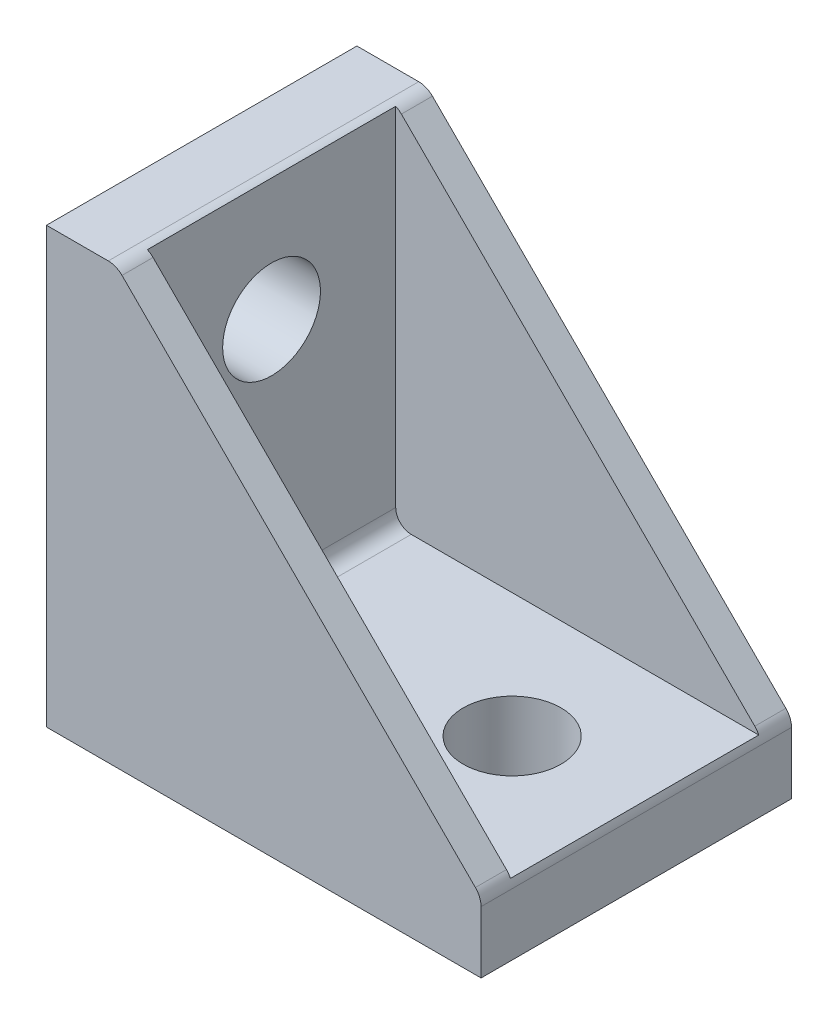
ISO-10303-21;
HEADER;
FILE_DESCRIPTION(('STEP AP214'),'2;1');
FILE_NAME('part.step','',(''),(''),'','','');
FILE_SCHEMA(('AUTOMOTIVE_DESIGN { 1 0 10303 214 1 1 1 1 }'));
ENDSEC;
DATA;
#1=APPLICATION_CONTEXT('core data for automotive mechanical design processes');
#2=APPLICATION_PROTOCOL_DEFINITION('international standard','automotive_design',2000,#1);
#3=PRODUCT_CONTEXT('',#1,'mechanical');
#4=PRODUCT('Part','Part','',(#3));
#5=PRODUCT_RELATED_PRODUCT_CATEGORY('part','',(#4));
#6=PRODUCT_DEFINITION_FORMATION('','',#4);
#7=PRODUCT_DEFINITION_CONTEXT('part definition',#1,'design');
#8=PRODUCT_DEFINITION('design','',#6,#7);
#9=PRODUCT_DEFINITION_SHAPE('','',#8);
#10=(LENGTH_UNIT() NAMED_UNIT(*) SI_UNIT(.MILLI.,.METRE.));
#11=(NAMED_UNIT(*) PLANE_ANGLE_UNIT() SI_UNIT($,.RADIAN.));
#12=(NAMED_UNIT(*) SI_UNIT($,.STERADIAN.) SOLID_ANGLE_UNIT());
#13=UNCERTAINTY_MEASURE_WITH_UNIT(LENGTH_MEASURE(1.E-05),#10,'distance_accuracy_value','');
#14=(GEOMETRIC_REPRESENTATION_CONTEXT(3) GLOBAL_UNCERTAINTY_ASSIGNED_CONTEXT((#13)) GLOBAL_UNIT_ASSIGNED_CONTEXT((#10,
#11,#12)) REPRESENTATION_CONTEXT('',''));
#15=CARTESIAN_POINT('',(0.,0.,0.));
#16=DIRECTION('',(0.,0.,1.));
#17=DIRECTION('',(1.,0.,0.));
#18=AXIS2_PLACEMENT_3D('',#15,#16,#17);
#19=CARTESIAN_POINT('',(4.5,28.,-10.));
#20=DIRECTION('',(0.707106781186545,0.70710678118655,0.));
#21=DIRECTION('',(-0.70710678118655,0.707106781186545,0.));
#22=AXIS2_PLACEMENT_3D('',#19,#20,#21);
#23=PLANE('',#22);
#24=DIRECTION('',(0.,0.,1.));
#25=VECTOR('',#24,1.);
#26=CARTESIAN_POINT('',(27.6338834764832,4.86611652351699,-10.));
#27=LINE('',#26,#25);
#28=CARTESIAN_POINT('',(27.6338834764832,4.86611652351699,8.));
#29=VERTEX_POINT('',#28);
#30=CARTESIAN_POINT('',(27.6338834764832,4.86611652351699,10.));
#31=VERTEX_POINT('',#30);
#32=EDGE_CURVE('E218',#29,#31,#27,.T.);
#33=ORIENTED_EDGE('',*,*,#32,.F.);
#34=DIRECTION('',(-0.70710678118655,0.707106781186545,0.));
#35=VECTOR('',#34,1.);
#36=CARTESIAN_POINT('',(4.5,28.,8.00000000000001));
#37=LINE('',#36,#35);
#38=CARTESIAN_POINT('',(4.86611652351682,27.6338834764832,8.00000000000001));
#39=VERTEX_POINT('',#38);
#40=EDGE_CURVE('E231',#29,#39,#37,.T.);
#41=ORIENTED_EDGE('',*,*,#40,.T.);
#42=DIRECTION('',(0.,0.,1.));
#43=VECTOR('',#42,1.);
#44=CARTESIAN_POINT('',(4.86611652351682,27.6338834764832,-10.));
#45=LINE('',#44,#43);
#46=CARTESIAN_POINT('',(4.86611652351682,27.6338834764832,10.));
#47=VERTEX_POINT('',#46);
#48=EDGE_CURVE('E432',#47,#39,#45,.F.);
#49=ORIENTED_EDGE('',*,*,#48,.F.);
#50=DIRECTION('',(0.70710678118655,-0.707106781186545,0.));
#51=VECTOR('',#50,1.);
#52=CARTESIAN_POINT('',(4.86611652351682,27.6338834764832,10.));
#53=LINE('',#52,#51);
#54=EDGE_CURVE('E337',#47,#31,#53,.T.);
#55=ORIENTED_EDGE('',*,*,#54,.T.);
#56=EDGE_LOOP('',(#33,#41,#49,#55));
#57=FACE_BOUND('',#56,.T.);
#58=ADVANCED_FACE('F15',(#57),#23,.T.);
#59=CARTESIAN_POINT('',(26.75,3.9822330470338,-10.));
#60=DIRECTION('',(0.,0.,1.));
#61=DIRECTION('',(1.,0.,0.));
#62=AXIS2_PLACEMENT_3D('',#59,#60,#61);
#63=CYLINDRICAL_SURFACE('',#62,1.25);
#64=DIRECTION('',(0.,0.,1.));
#65=VECTOR('',#64,1.);
#66=CARTESIAN_POINT('',(27.8877246514056,4.5,-10.));
#67=LINE('',#66,#65);
#68=CARTESIAN_POINT('',(27.8877246514056,4.5,-8.));
#69=VERTEX_POINT('',#68);
#70=CARTESIAN_POINT('',(27.8877246514056,4.5,8.));
#71=VERTEX_POINT('',#70);
#72=EDGE_CURVE('E206',#69,#71,#67,.T.);
#73=ORIENTED_EDGE('',*,*,#72,.T.);
#74=CARTESIAN_POINT('',(26.75,3.9822330470338,8.));
#75=DIRECTION('',(0.,0.,-1.));
#76=DIRECTION('',(-1.,0.,0.));
#77=AXIS2_PLACEMENT_3D('',#74,#75,#76);
#78=CIRCLE('',#77,1.25);
#79=EDGE_CURVE('E235',#71,#29,#78,.F.);
#80=ORIENTED_EDGE('',*,*,#79,.T.);
#81=ORIENTED_EDGE('',*,*,#32,.T.);
#82=CARTESIAN_POINT('',(26.75,3.9822330470338,10.));
#83=DIRECTION('',(0.,0.,1.));
#84=DIRECTION('',(1.,0.,0.));
#85=AXIS2_PLACEMENT_3D('',#82,#83,#84);
#86=CIRCLE('',#85,1.25);
#87=CARTESIAN_POINT('',(28.,3.9822330470338,10.));
#88=VERTEX_POINT('',#87);
#89=EDGE_CURVE('E340',#31,#88,#86,.F.);
#90=ORIENTED_EDGE('',*,*,#89,.T.);
#91=DIRECTION('',(0.,0.,-1.));
#92=VECTOR('',#91,1.);
#93=CARTESIAN_POINT('',(28.,3.9822330470338,-10.));
#94=LINE('',#93,#92);
#95=CARTESIAN_POINT('',(28.,3.9822330470338,-10.));
#96=VERTEX_POINT('',#95);
#97=EDGE_CURVE('E325',#96,#88,#94,.F.);
#98=ORIENTED_EDGE('',*,*,#97,.F.);
#99=CARTESIAN_POINT('',(26.75,3.9822330470338,-10.));
#100=DIRECTION('',(0.,0.,1.));
#101=DIRECTION('',(1.,0.,0.));
#102=AXIS2_PLACEMENT_3D('',#99,#100,#101);
#103=CIRCLE('',#102,1.25);
#104=CARTESIAN_POINT('',(27.6338834764832,4.86611652351699,-10.));
#105=VERTEX_POINT('',#104);
#106=EDGE_CURVE('E219',#96,#105,#103,.T.);
#107=ORIENTED_EDGE('',*,*,#106,.T.);
#108=DIRECTION('',(0.,0.,1.));
#109=VECTOR('',#108,1.);
#110=CARTESIAN_POINT('',(27.6338834764832,4.86611652351699,-10.));
#111=LINE('',#110,#109);
#112=CARTESIAN_POINT('',(27.6338834764832,4.86611652351699,-8.));
#113=VERTEX_POINT('',#112);
#114=EDGE_CURVE('E230',#113,#105,#111,.F.);
#115=ORIENTED_EDGE('',*,*,#114,.F.);
#116=CARTESIAN_POINT('',(26.75,3.9822330470338,-8.));
#117=DIRECTION('',(0.,0.,1.));
#118=DIRECTION('',(1.,0.,0.));
#119=AXIS2_PLACEMENT_3D('',#116,#117,#118);
#120=CIRCLE('',#119,1.25);
#121=EDGE_CURVE('E223',#113,#69,#120,.F.);
#122=ORIENTED_EDGE('',*,*,#121,.T.);
#123=EDGE_LOOP('',(#73,#80,#81,#90,#98,#107,#115,#122));
#124=FACE_BOUND('',#123,.T.);
#125=ADVANCED_FACE('F228',(#124),#63,.T.);
#126=CARTESIAN_POINT('',(3.98223304703363,26.75,-10.));
#127=DIRECTION('',(0.,0.,1.));
#128=DIRECTION('',(1.,0.,0.));
#129=AXIS2_PLACEMENT_3D('',#126,#127,#128);
#130=CYLINDRICAL_SURFACE('',#129,1.25);
#131=DIRECTION('',(0.,0.,1.));
#132=VECTOR('',#131,1.);
#133=CARTESIAN_POINT('',(4.5,27.8877246514056,-10.));
#134=LINE('',#133,#132);
#135=CARTESIAN_POINT('',(4.5,27.8877246514056,8.00000000000001));
#136=VERTEX_POINT('',#135);
#137=CARTESIAN_POINT('',(4.5,27.8877246514056,-8.));
#138=VERTEX_POINT('',#137);
#139=EDGE_CURVE('E332',#136,#138,#134,.F.);
#140=ORIENTED_EDGE('',*,*,#139,.T.);
#141=CARTESIAN_POINT('',(3.98223304703363,26.75,-8.));
#142=DIRECTION('',(0.,0.,1.));
#143=DIRECTION('',(1.,0.,0.));
#144=AXIS2_PLACEMENT_3D('',#141,#142,#143);
#145=CIRCLE('',#144,1.25);
#146=CARTESIAN_POINT('',(4.86611652351682,27.6338834764832,-8.));
#147=VERTEX_POINT('',#146);
#148=EDGE_CURVE('E232',#138,#147,#145,.F.);
#149=ORIENTED_EDGE('',*,*,#148,.T.);
#150=DIRECTION('',(0.,0.,1.));
#151=VECTOR('',#150,1.);
#152=CARTESIAN_POINT('',(4.86611652351682,27.6338834764832,-10.));
#153=LINE('',#152,#151);
#154=CARTESIAN_POINT('',(4.86611652351682,27.6338834764832,-10.));
#155=VERTEX_POINT('',#154);
#156=EDGE_CURVE('E328',#155,#147,#153,.T.);
#157=ORIENTED_EDGE('',*,*,#156,.F.);
#158=CARTESIAN_POINT('',(3.98223304703363,26.75,-10.));
#159=DIRECTION('',(0.,0.,1.));
#160=DIRECTION('',(1.,0.,0.));
#161=AXIS2_PLACEMENT_3D('',#158,#159,#160);
#162=CIRCLE('',#161,1.25);
#163=CARTESIAN_POINT('',(3.98223304703363,28.,-10.));
#164=VERTEX_POINT('',#163);
#165=EDGE_CURVE('E443',#155,#164,#162,.T.);
#166=ORIENTED_EDGE('',*,*,#165,.T.);
#167=DIRECTION('',(0.,0.,1.));
#168=VECTOR('',#167,1.);
#169=CARTESIAN_POINT('',(3.98223304703363,28.,-10.));
#170=LINE('',#169,#168);
#171=CARTESIAN_POINT('',(3.98223304703363,28.,10.));
#172=VERTEX_POINT('',#171);
#173=EDGE_CURVE('E256',#172,#164,#170,.F.);
#174=ORIENTED_EDGE('',*,*,#173,.F.);
#175=CARTESIAN_POINT('',(3.98223304703363,26.75,10.));
#176=DIRECTION('',(0.,0.,1.));
#177=DIRECTION('',(1.,0.,0.));
#178=AXIS2_PLACEMENT_3D('',#175,#176,#177);
#179=CIRCLE('',#178,1.25);
#180=EDGE_CURVE('E435',#172,#47,#179,.F.);
#181=ORIENTED_EDGE('',*,*,#180,.T.);
#182=ORIENTED_EDGE('',*,*,#48,.T.);
#183=CARTESIAN_POINT('',(3.98223304703363,26.75,8.00000000000001));
#184=DIRECTION('',(0.,0.,-1.));
#185=DIRECTION('',(-1.,0.,0.));
#186=AXIS2_PLACEMENT_3D('',#183,#184,#185);
#187=CIRCLE('',#186,1.25);
#188=EDGE_CURVE('E452',#39,#136,#187,.F.);
#189=ORIENTED_EDGE('',*,*,#188,.T.);
#190=EDGE_LOOP('',(#140,#149,#157,#166,#174,#181,#182,#189));
#191=FACE_BOUND('',#190,.T.);
#192=ADVANCED_FACE('F475',(#191),#130,.T.);
#193=CARTESIAN_POINT('',(4.5,28.,-10.));
#194=DIRECTION('',(0.707106781186545,0.70710678118655,0.));
#195=DIRECTION('',(-0.70710678118655,0.707106781186545,0.));
#196=AXIS2_PLACEMENT_3D('',#193,#194,#195);
#197=PLANE('',#196);
#198=ORIENTED_EDGE('',*,*,#156,.T.);
#199=DIRECTION('',(0.70710678118655,-0.707106781186545,0.));
#200=VECTOR('',#199,1.);
#201=CARTESIAN_POINT('',(4.5,28.,-8.));
#202=LINE('',#201,#200);
#203=EDGE_CURVE('E246',#147,#113,#202,.T.);
#204=ORIENTED_EDGE('',*,*,#203,.T.);
#205=ORIENTED_EDGE('',*,*,#114,.T.);
#206=DIRECTION('',(0.70710678118655,-0.707106781186545,0.));
#207=VECTOR('',#206,1.);
#208=CARTESIAN_POINT('',(4.86611652351682,27.6338834764832,-10.));
#209=LINE('',#208,#207);
#210=EDGE_CURVE('E252',#155,#105,#209,.T.);
#211=ORIENTED_EDGE('',*,*,#210,.F.);
#212=EDGE_LOOP('',(#198,#204,#205,#211));
#213=FACE_BOUND('',#212,.T.);
#214=ADVANCED_FACE('F496',(#213),#197,.T.);
#215=CARTESIAN_POINT('',(23.5,-0.7,-4.));
#216=DIRECTION('',(0.,-1.,0.));
#217=DIRECTION('',(1.,0.,0.));
#218=AXIS2_PLACEMENT_3D('',#215,#216,#217);
#219=PLANE('',#218);
#220=DIRECTION('',(0.,0.,1.));
#221=VECTOR('',#220,1.);
#222=CARTESIAN_POINT('',(23.5,-0.7,-4.));
#223=LINE('',#222,#221);
#224=CARTESIAN_POINT('',(23.5,-0.7,-4.));
#225=VERTEX_POINT('',#224);
#226=CARTESIAN_POINT('',(23.5,-0.7,4.));
#227=VERTEX_POINT('',#226);
#228=EDGE_CURVE('E425',#225,#227,#223,.T.);
#229=ORIENTED_EDGE('',*,*,#228,.F.);
#230=DIRECTION('',(-1.,0.,0.));
#231=VECTOR('',#230,1.);
#232=CARTESIAN_POINT('',(19.5,-0.7,-4.));
#233=LINE('',#232,#231);
#234=CARTESIAN_POINT('',(25.5,-0.7,-4.));
#235=VERTEX_POINT('',#234);
#236=EDGE_CURVE('E428',#235,#225,#233,.T.);
#237=ORIENTED_EDGE('',*,*,#236,.F.);
#238=DIRECTION('',(0.,0.,1.));
#239=VECTOR('',#238,1.);
#240=CARTESIAN_POINT('',(25.5,-0.7,-4.));
#241=LINE('',#240,#239);
#242=CARTESIAN_POINT('',(25.5,-0.7,4.));
#243=VERTEX_POINT('',#242);
#244=EDGE_CURVE('E412',#243,#235,#241,.F.);
#245=ORIENTED_EDGE('',*,*,#244,.F.);
#246=DIRECTION('',(-1.,0.,0.));
#247=VECTOR('',#246,1.);
#248=CARTESIAN_POINT('',(19.5,-0.7,4.));
#249=LINE('',#248,#247);
#250=EDGE_CURVE('E420',#243,#227,#249,.T.);
#251=ORIENTED_EDGE('',*,*,#250,.T.);
#252=EDGE_LOOP('',(#229,#237,#245,#251));
#253=FACE_BOUND('',#252,.T.);
#254=ADVANCED_FACE('F493',(#253),#219,.T.);
#255=CARTESIAN_POINT('',(4.,-0.7,-4.));
#256=DIRECTION('',(0.,-1.,0.));
#257=DIRECTION('',(1.,0.,0.));
#258=AXIS2_PLACEMENT_3D('',#255,#256,#257);
#259=PLANE('',#258);
#260=DIRECTION('',(0.,0.,1.));
#261=VECTOR('',#260,1.);
#262=CARTESIAN_POINT('',(4.,-0.7,-4.));
#263=LINE('',#262,#261);
#264=CARTESIAN_POINT('',(4.,-0.7,-4.));
#265=VERTEX_POINT('',#264);
#266=CARTESIAN_POINT('',(4.,-0.7,4.));
#267=VERTEX_POINT('',#266);
#268=EDGE_CURVE('E403',#265,#267,#263,.T.);
#269=ORIENTED_EDGE('',*,*,#268,.F.);
#270=DIRECTION('',(-1.,0.,0.));
#271=VECTOR('',#270,1.);
#272=CARTESIAN_POINT('',(0.,-0.7,-4.));
#273=LINE('',#272,#271);
#274=CARTESIAN_POINT('',(6.,-0.7,-4.));
#275=VERTEX_POINT('',#274);
#276=EDGE_CURVE('E406',#275,#265,#273,.T.);
#277=ORIENTED_EDGE('',*,*,#276,.F.);
#278=DIRECTION('',(0.,0.,1.));
#279=VECTOR('',#278,1.);
#280=CARTESIAN_POINT('',(6.,-0.7,-4.));
#281=LINE('',#280,#279);
#282=CARTESIAN_POINT('',(6.,-0.7,4.));
#283=VERTEX_POINT('',#282);
#284=EDGE_CURVE('E390',#283,#275,#281,.F.);
#285=ORIENTED_EDGE('',*,*,#284,.F.);
#286=DIRECTION('',(-1.,0.,0.));
#287=VECTOR('',#286,1.);
#288=CARTESIAN_POINT('',(0.,-0.7,4.));
#289=LINE('',#288,#287);
#290=EDGE_CURVE('E398',#283,#267,#289,.T.);
#291=ORIENTED_EDGE('',*,*,#290,.T.);
#292=EDGE_LOOP('',(#269,#277,#285,#291));
#293=FACE_BOUND('',#292,.T.);
#294=ADVANCED_FACE('F491',(#293),#259,.T.);
#295=CARTESIAN_POINT('',(4.5,4.5,7.5));
#296=DIRECTION('',(0.,1.,0.));
#297=DIRECTION('',(0.,0.,1.));
#298=AXIS2_PLACEMENT_3D('',#295,#296,#297);
#299=PLANE('',#298);
#300=DIRECTION('',(-1.,0.,0.));
#301=VECTOR('',#300,1.);
#302=CARTESIAN_POINT('',(28.,4.5,-8.));
#303=LINE('',#302,#301);
#304=CARTESIAN_POINT('',(5.5,4.5,-8.));
#305=VERTEX_POINT('',#304);
#306=EDGE_CURVE('E211',#69,#305,#303,.T.);
#307=ORIENTED_EDGE('',*,*,#306,.T.);
#308=DIRECTION('',(0.,0.,1.));
#309=VECTOR('',#308,1.);
#310=CARTESIAN_POINT('',(5.5,4.5,8.));
#311=LINE('',#310,#309);
#312=CARTESIAN_POINT('',(5.5,4.5,8.));
#313=VERTEX_POINT('',#312);
#314=EDGE_CURVE('E455',#305,#313,#311,.T.);
#315=ORIENTED_EDGE('',*,*,#314,.T.);
#316=DIRECTION('',(1.,0.,0.));
#317=VECTOR('',#316,1.);
#318=CARTESIAN_POINT('',(28.,4.5,8.));
#319=LINE('',#318,#317);
#320=EDGE_CURVE('E213',#313,#71,#319,.T.);
#321=ORIENTED_EDGE('',*,*,#320,.T.);
#322=ORIENTED_EDGE('',*,*,#72,.F.);
#323=EDGE_LOOP('',(#307,#315,#321,#322));
#324=FACE_BOUND('',#323,.T.);
#325=CARTESIAN_POINT('',(20.,4.5,0.));
#326=DIRECTION('',(0.,-1.,0.));
#327=DIRECTION('',(0.,0.,-1.));
#328=AXIS2_PLACEMENT_3D('',#325,#326,#327);
#329=CIRCLE('',#328,3.15);
#330=CARTESIAN_POINT('',(20.,4.5,-3.15));
#331=VERTEX_POINT('',#330);
#332=EDGE_CURVE('E385',#331,#331,#329,.T.);
#333=ORIENTED_EDGE('',*,*,#332,.T.);
#334=EDGE_LOOP('',(#333));
#335=FACE_BOUND('',#334,.T.);
#336=ADVANCED_FACE('F208',(#324,#335),#299,.T.);
#337=CARTESIAN_POINT('',(-0.7,4.,-4.));
#338=DIRECTION('',(-1.,0.,0.));
#339=DIRECTION('',(0.,0.,1.));
#340=AXIS2_PLACEMENT_3D('',#337,#338,#339);
#341=PLANE('',#340);
#342=DIRECTION('',(0.,0.,1.));
#343=VECTOR('',#342,1.);
#344=CARTESIAN_POINT('',(-0.7,6.,-4.));
#345=LINE('',#344,#343);
#346=CARTESIAN_POINT('',(-0.7,6.,-4.));
#347=VERTEX_POINT('',#346);
#348=CARTESIAN_POINT('',(-0.7,6.,4.));
#349=VERTEX_POINT('',#348);
#350=EDGE_CURVE('E376',#347,#349,#345,.T.);
#351=ORIENTED_EDGE('',*,*,#350,.F.);
#352=DIRECTION('',(0.,1.,0.));
#353=VECTOR('',#352,1.);
#354=CARTESIAN_POINT('',(-0.7,0.,-4.));
#355=LINE('',#354,#353);
#356=CARTESIAN_POINT('',(-0.7,4.,-4.));
#357=VERTEX_POINT('',#356);
#358=EDGE_CURVE('E380',#347,#357,#355,.F.);
#359=ORIENTED_EDGE('',*,*,#358,.T.);
#360=DIRECTION('',(0.,0.,1.));
#361=VECTOR('',#360,1.);
#362=CARTESIAN_POINT('',(-0.7,4.,-4.));
#363=LINE('',#362,#361);
#364=CARTESIAN_POINT('',(-0.7,4.,4.));
#365=VERTEX_POINT('',#364);
#366=EDGE_CURVE('E382',#365,#357,#363,.F.);
#367=ORIENTED_EDGE('',*,*,#366,.F.);
#368=DIRECTION('',(0.,1.,0.));
#369=VECTOR('',#368,1.);
#370=CARTESIAN_POINT('',(-0.7,0.,4.));
#371=LINE('',#370,#369);
#372=EDGE_CURVE('E367',#349,#365,#371,.F.);
#373=ORIENTED_EDGE('',*,*,#372,.F.);
#374=EDGE_LOOP('',(#351,#359,#367,#373));
#375=FACE_BOUND('',#374,.T.);
#376=ADVANCED_FACE('F484',(#375),#341,.T.);
#377=CARTESIAN_POINT('',(-0.7,23.5,-4.));
#378=DIRECTION('',(-1.,0.,0.));
#379=DIRECTION('',(0.,0.,1.));
#380=AXIS2_PLACEMENT_3D('',#377,#378,#379);
#381=PLANE('',#380);
#382=DIRECTION('',(0.,0.,1.));
#383=VECTOR('',#382,1.);
#384=CARTESIAN_POINT('',(-0.7,25.5,-4.));
#385=LINE('',#384,#383);
#386=CARTESIAN_POINT('',(-0.7,25.5,-4.));
#387=VERTEX_POINT('',#386);
#388=CARTESIAN_POINT('',(-0.7,25.5,4.));
#389=VERTEX_POINT('',#388);
#390=EDGE_CURVE('E353',#387,#389,#385,.T.);
#391=ORIENTED_EDGE('',*,*,#390,.F.);
#392=DIRECTION('',(0.,1.,0.));
#393=VECTOR('',#392,1.);
#394=CARTESIAN_POINT('',(-0.7,19.5,-4.));
#395=LINE('',#394,#393);
#396=CARTESIAN_POINT('',(-0.7,23.5,-4.));
#397=VERTEX_POINT('',#396);
#398=EDGE_CURVE('E357',#387,#397,#395,.F.);
#399=ORIENTED_EDGE('',*,*,#398,.T.);
#400=DIRECTION('',(0.,0.,1.));
#401=VECTOR('',#400,1.);
#402=CARTESIAN_POINT('',(-0.7,23.5,-4.));
#403=LINE('',#402,#401);
#404=CARTESIAN_POINT('',(-0.7,23.5,4.));
#405=VERTEX_POINT('',#404);
#406=EDGE_CURVE('E359',#405,#397,#403,.F.);
#407=ORIENTED_EDGE('',*,*,#406,.F.);
#408=DIRECTION('',(0.,1.,0.));
#409=VECTOR('',#408,1.);
#410=CARTESIAN_POINT('',(-0.7,19.5,4.));
#411=LINE('',#410,#409);
#412=EDGE_CURVE('E344',#389,#405,#411,.F.);
#413=ORIENTED_EDGE('',*,*,#412,.F.);
#414=EDGE_LOOP('',(#391,#399,#407,#413));
#415=FACE_BOUND('',#414,.T.);
#416=ADVANCED_FACE('F481',(#415),#381,.T.);
#417=CARTESIAN_POINT('',(4.5,4.5,7.5));
#418=DIRECTION('',(1.,0.,0.));
#419=DIRECTION('',(0.,0.,-1.));
#420=AXIS2_PLACEMENT_3D('',#417,#418,#419);
#421=PLANE('',#420);
#422=CARTESIAN_POINT('',(4.5,20.,0.));
#423=DIRECTION('',(-1.,0.,0.));
#424=DIRECTION('',(0.,0.,1.));
#425=AXIS2_PLACEMENT_3D('',#422,#423,#424);
#426=CIRCLE('',#425,3.15);
#427=CARTESIAN_POINT('',(4.5,20.,3.15));
#428=VERTEX_POINT('',#427);
#429=EDGE_CURVE('E362',#428,#428,#426,.T.);
#430=ORIENTED_EDGE('',*,*,#429,.T.);
#431=EDGE_LOOP('',(#430));
#432=FACE_BOUND('',#431,.T.);
#433=DIRECTION('',(0.,-1.,0.));
#434=VECTOR('',#433,1.);
#435=CARTESIAN_POINT('',(4.5,28.0001030776406,8.));
#436=LINE('',#435,#434);
#437=CARTESIAN_POINT('',(4.5,5.5,8.));
#438=VERTEX_POINT('',#437);
#439=EDGE_CURVE('E459',#136,#438,#436,.T.);
#440=ORIENTED_EDGE('',*,*,#439,.T.);
#441=DIRECTION('',(0.,0.,1.));
#442=VECTOR('',#441,1.);
#443=CARTESIAN_POINT('',(4.5,5.5,-8.));
#444=LINE('',#443,#442);
#445=CARTESIAN_POINT('',(4.5,5.5,-8.));
#446=VERTEX_POINT('',#445);
#447=EDGE_CURVE('E23',#438,#446,#444,.F.);
#448=ORIENTED_EDGE('',*,*,#447,.T.);
#449=DIRECTION('',(0.,-1.,0.));
#450=VECTOR('',#449,1.);
#451=CARTESIAN_POINT('',(4.5,28.0001030776406,-8.));
#452=LINE('',#451,#450);
#453=EDGE_CURVE('E238',#138,#446,#452,.T.);
#454=ORIENTED_EDGE('',*,*,#453,.F.);
#455=ORIENTED_EDGE('',*,*,#139,.F.);
#456=EDGE_LOOP('',(#440,#448,#454,#455));
#457=FACE_BOUND('',#456,.T.);
#458=ADVANCED_FACE('F480',(#432,#457),#421,.T.);
#459=CARTESIAN_POINT('',(19.5,0.,-4.));
#460=DIRECTION('',(0.,0.,-1.));
#461=DIRECTION('',(-1.,0.,0.));
#462=AXIS2_PLACEMENT_3D('',#459,#460,#461);
#463=PLANE('',#462);
#464=DIRECTION('',(0.,1.,0.));
#465=VECTOR('',#464,1.);
#466=CARTESIAN_POINT('',(25.5,-0.7,-4.));
#467=LINE('',#466,#465);
#468=CARTESIAN_POINT('',(25.5,0.,-4.));
#469=VERTEX_POINT('',#468);
#470=EDGE_CURVE('E409',#235,#469,#467,.T.);
#471=ORIENTED_EDGE('',*,*,#470,.F.);
#472=ORIENTED_EDGE('',*,*,#236,.T.);
#473=DIRECTION('',(0.,-1.,0.));
#474=VECTOR('',#473,1.);
#475=CARTESIAN_POINT('',(23.5,-0.7,-4.));
#476=LINE('',#475,#474);
#477=CARTESIAN_POINT('',(23.5,0.,-4.));
#478=VERTEX_POINT('',#477);
#479=EDGE_CURVE('E422',#478,#225,#476,.T.);
#480=ORIENTED_EDGE('',*,*,#479,.F.);
#481=DIRECTION('',(1.,0.,0.));
#482=VECTOR('',#481,1.);
#483=CARTESIAN_POINT('',(0.,0.,-4.));
#484=LINE('',#483,#482);
#485=EDGE_CURVE('E318',#469,#478,#484,.F.);
#486=ORIENTED_EDGE('',*,*,#485,.F.);
#487=EDGE_LOOP('',(#471,#472,#480,#486));
#488=FACE_BOUND('',#487,.T.);
#489=ADVANCED_FACE('F602',(#488),#463,.T.);
#490=CARTESIAN_POINT('',(23.5,-0.7,-4.));
#491=DIRECTION('',(-1.,0.,0.));
#492=DIRECTION('',(0.,-1.,0.));
#493=AXIS2_PLACEMENT_3D('',#490,#491,#492);
#494=PLANE('',#493);
#495=DIRECTION('',(0.,0.,-1.));
#496=VECTOR('',#495,1.);
#497=CARTESIAN_POINT('',(23.5,0.,-10.));
#498=LINE('',#497,#496);
#499=CARTESIAN_POINT('',(23.5,0.,4.));
#500=VERTEX_POINT('',#499);
#501=EDGE_CURVE('E315',#478,#500,#498,.F.);
#502=ORIENTED_EDGE('',*,*,#501,.F.);
#503=ORIENTED_EDGE('',*,*,#479,.T.);
#504=ORIENTED_EDGE('',*,*,#228,.T.);
#505=DIRECTION('',(0.,1.,0.));
#506=VECTOR('',#505,1.);
#507=CARTESIAN_POINT('',(23.5,0.,4.));
#508=LINE('',#507,#506);
#509=EDGE_CURVE('E418',#227,#500,#508,.T.);
#510=ORIENTED_EDGE('',*,*,#509,.T.);
#511=EDGE_LOOP('',(#502,#503,#504,#510));
#512=FACE_BOUND('',#511,.T.);
#513=ADVANCED_FACE('F598',(#512),#494,.T.);
#514=CARTESIAN_POINT('',(19.5,0.,4.));
#515=DIRECTION('',(0.,0.,-1.));
#516=DIRECTION('',(-1.,0.,0.));
#517=AXIS2_PLACEMENT_3D('',#514,#515,#516);
#518=PLANE('',#517);
#519=ORIENTED_EDGE('',*,*,#250,.F.);
#520=DIRECTION('',(0.,1.,0.));
#521=VECTOR('',#520,1.);
#522=CARTESIAN_POINT('',(25.5,-0.7,4.));
#523=LINE('',#522,#521);
#524=CARTESIAN_POINT('',(25.5,0.,4.));
#525=VERTEX_POINT('',#524);
#526=EDGE_CURVE('E415',#525,#243,#523,.F.);
#527=ORIENTED_EDGE('',*,*,#526,.F.);
#528=DIRECTION('',(1.,0.,0.));
#529=VECTOR('',#528,1.);
#530=CARTESIAN_POINT('',(0.,0.,4.));
#531=LINE('',#530,#529);
#532=EDGE_CURVE('E312',#500,#525,#531,.T.);
#533=ORIENTED_EDGE('',*,*,#532,.F.);
#534=ORIENTED_EDGE('',*,*,#509,.F.);
#535=EDGE_LOOP('',(#519,#527,#533,#534));
#536=FACE_BOUND('',#535,.T.);
#537=ADVANCED_FACE('F594',(#536),#518,.F.);
#538=CARTESIAN_POINT('',(25.5,-0.7,-4.));
#539=DIRECTION('',(1.,0.,0.));
#540=DIRECTION('',(0.,1.,0.));
#541=AXIS2_PLACEMENT_3D('',#538,#539,#540);
#542=PLANE('',#541);
#543=ORIENTED_EDGE('',*,*,#244,.T.);
#544=ORIENTED_EDGE('',*,*,#470,.T.);
#545=DIRECTION('',(0.,0.,-1.));
#546=VECTOR('',#545,1.);
#547=CARTESIAN_POINT('',(25.5,0.,-10.));
#548=LINE('',#547,#546);
#549=EDGE_CURVE('E309',#525,#469,#548,.T.);
#550=ORIENTED_EDGE('',*,*,#549,.F.);
#551=ORIENTED_EDGE('',*,*,#526,.T.);
#552=EDGE_LOOP('',(#543,#544,#550,#551));
#553=FACE_BOUND('',#552,.T.);
#554=ADVANCED_FACE('F590',(#553),#542,.T.);
#555=CARTESIAN_POINT('',(0.,0.,-4.));
#556=DIRECTION('',(0.,0.,-1.));
#557=DIRECTION('',(-1.,0.,0.));
#558=AXIS2_PLACEMENT_3D('',#555,#556,#557);
#559=PLANE('',#558);
#560=DIRECTION('',(0.,1.,0.));
#561=VECTOR('',#560,1.);
#562=CARTESIAN_POINT('',(6.,-0.7,-4.));
#563=LINE('',#562,#561);
#564=CARTESIAN_POINT('',(6.,0.,-4.));
#565=VERTEX_POINT('',#564);
#566=EDGE_CURVE('E387',#275,#565,#563,.T.);
#567=ORIENTED_EDGE('',*,*,#566,.F.);
#568=ORIENTED_EDGE('',*,*,#276,.T.);
#569=DIRECTION('',(0.,-1.,0.));
#570=VECTOR('',#569,1.);
#571=CARTESIAN_POINT('',(4.,-0.7,-4.));
#572=LINE('',#571,#570);
#573=CARTESIAN_POINT('',(4.,0.,-4.));
#574=VERTEX_POINT('',#573);
#575=EDGE_CURVE('E400',#574,#265,#572,.T.);
#576=ORIENTED_EDGE('',*,*,#575,.F.);
#577=DIRECTION('',(1.,0.,0.));
#578=VECTOR('',#577,1.);
#579=CARTESIAN_POINT('',(0.,0.,-4.));
#580=LINE('',#579,#578);
#581=EDGE_CURVE('E306',#565,#574,#580,.F.);
#582=ORIENTED_EDGE('',*,*,#581,.F.);
#583=EDGE_LOOP('',(#567,#568,#576,#582));
#584=FACE_BOUND('',#583,.T.);
#585=ADVANCED_FACE('F586',(#584),#559,.T.);
#586=CARTESIAN_POINT('',(4.,-0.7,-4.));
#587=DIRECTION('',(-1.,0.,0.));
#588=DIRECTION('',(0.,-1.,0.));
#589=AXIS2_PLACEMENT_3D('',#586,#587,#588);
#590=PLANE('',#589);
#591=DIRECTION('',(0.,0.,-1.));
#592=VECTOR('',#591,1.);
#593=CARTESIAN_POINT('',(4.,0.,-10.));
#594=LINE('',#593,#592);
#595=CARTESIAN_POINT('',(4.,0.,4.));
#596=VERTEX_POINT('',#595);
#597=EDGE_CURVE('E303',#574,#596,#594,.F.);
#598=ORIENTED_EDGE('',*,*,#597,.F.);
#599=ORIENTED_EDGE('',*,*,#575,.T.);
#600=ORIENTED_EDGE('',*,*,#268,.T.);
#601=DIRECTION('',(0.,1.,0.));
#602=VECTOR('',#601,1.);
#603=CARTESIAN_POINT('',(4.,0.,4.));
#604=LINE('',#603,#602);
#605=EDGE_CURVE('E396',#267,#596,#604,.T.);
#606=ORIENTED_EDGE('',*,*,#605,.T.);
#607=EDGE_LOOP('',(#598,#599,#600,#606));
#608=FACE_BOUND('',#607,.T.);
#609=ADVANCED_FACE('F582',(#608),#590,.T.);
#610=CARTESIAN_POINT('',(0.,0.,4.));
#611=DIRECTION('',(0.,0.,-1.));
#612=DIRECTION('',(-1.,0.,0.));
#613=AXIS2_PLACEMENT_3D('',#610,#611,#612);
#614=PLANE('',#613);
#615=ORIENTED_EDGE('',*,*,#290,.F.);
#616=DIRECTION('',(0.,1.,0.));
#617=VECTOR('',#616,1.);
#618=CARTESIAN_POINT('',(6.,-0.7,4.));
#619=LINE('',#618,#617);
#620=CARTESIAN_POINT('',(6.,0.,4.));
#621=VERTEX_POINT('',#620);
#622=EDGE_CURVE('E393',#621,#283,#619,.F.);
#623=ORIENTED_EDGE('',*,*,#622,.F.);
#624=DIRECTION('',(1.,0.,0.));
#625=VECTOR('',#624,1.);
#626=CARTESIAN_POINT('',(0.,0.,4.));
#627=LINE('',#626,#625);
#628=EDGE_CURVE('E300',#596,#621,#627,.T.);
#629=ORIENTED_EDGE('',*,*,#628,.F.);
#630=ORIENTED_EDGE('',*,*,#605,.F.);
#631=EDGE_LOOP('',(#615,#623,#629,#630));
#632=FACE_BOUND('',#631,.T.);
#633=ADVANCED_FACE('F578',(#632),#614,.F.);
#634=CARTESIAN_POINT('',(6.,-0.7,-4.));
#635=DIRECTION('',(1.,0.,0.));
#636=DIRECTION('',(0.,1.,0.));
#637=AXIS2_PLACEMENT_3D('',#634,#635,#636);
#638=PLANE('',#637);
#639=ORIENTED_EDGE('',*,*,#284,.T.);
#640=ORIENTED_EDGE('',*,*,#566,.T.);
#641=DIRECTION('',(0.,0.,-1.));
#642=VECTOR('',#641,1.);
#643=CARTESIAN_POINT('',(6.,0.,-10.));
#644=LINE('',#643,#642);
#645=EDGE_CURVE('E296',#621,#565,#644,.T.);
#646=ORIENTED_EDGE('',*,*,#645,.F.);
#647=ORIENTED_EDGE('',*,*,#622,.T.);
#648=EDGE_LOOP('',(#639,#640,#646,#647));
#649=FACE_BOUND('',#648,.T.);
#650=ADVANCED_FACE('F574',(#649),#638,.T.);
#651=CARTESIAN_POINT('',(20.,0.,0.));
#652=DIRECTION('',(0.,-1.,0.));
#653=DIRECTION('',(0.,0.,-1.));
#654=AXIS2_PLACEMENT_3D('',#651,#652,#653);
#655=CYLINDRICAL_SURFACE('',#654,3.15);
#656=CARTESIAN_POINT('',(20.,0.,0.));
#657=DIRECTION('',(0.,-1.,0.));
#658=DIRECTION('',(0.,0.,-1.));
#659=AXIS2_PLACEMENT_3D('',#656,#657,#658);
#660=CIRCLE('',#659,3.15);
#661=CARTESIAN_POINT('',(20.,0.,-3.15));
#662=VERTEX_POINT('',#661);
#663=EDGE_CURVE('E299',#662,#662,#660,.F.);
#664=ORIENTED_EDGE('',*,*,#663,.F.);
#665=EDGE_LOOP('',(#664));
#666=FACE_BOUND('',#665,.T.);
#667=ORIENTED_EDGE('',*,*,#332,.F.);
#668=EDGE_LOOP('',(#667));
#669=FACE_BOUND('',#668,.T.);
#670=ADVANCED_FACE('F570',(#666,#669),#655,.F.);
#671=CARTESIAN_POINT('',(0.,4.,-4.));
#672=DIRECTION('',(0.,-1.,0.));
#673=DIRECTION('',(1.,0.,0.));
#674=AXIS2_PLACEMENT_3D('',#671,#672,#673);
#675=PLANE('',#674);
#676=ORIENTED_EDGE('',*,*,#366,.T.);
#677=DIRECTION('',(1.,0.,0.));
#678=VECTOR('',#677,1.);
#679=CARTESIAN_POINT('',(0.,4.,-4.));
#680=LINE('',#679,#678);
#681=CARTESIAN_POINT('',(0.,4.,-4.));
#682=VERTEX_POINT('',#681);
#683=EDGE_CURVE('E378',#357,#682,#680,.T.);
#684=ORIENTED_EDGE('',*,*,#683,.T.);
#685=DIRECTION('',(0.,0.,1.));
#686=VECTOR('',#685,1.);
#687=CARTESIAN_POINT('',(0.,4.,-10.));
#688=LINE('',#687,#686);
#689=CARTESIAN_POINT('',(0.,4.,4.));
#690=VERTEX_POINT('',#689);
#691=EDGE_CURVE('E287',#690,#682,#688,.F.);
#692=ORIENTED_EDGE('',*,*,#691,.F.);
#693=DIRECTION('',(1.,0.,0.));
#694=VECTOR('',#693,1.);
#695=CARTESIAN_POINT('',(0.,4.,4.));
#696=LINE('',#695,#694);
#697=EDGE_CURVE('E364',#365,#690,#696,.T.);
#698=ORIENTED_EDGE('',*,*,#697,.F.);
#699=EDGE_LOOP('',(#676,#684,#692,#698));
#700=FACE_BOUND('',#699,.T.);
#701=ADVANCED_FACE('F566',(#700),#675,.T.);
#702=CARTESIAN_POINT('',(0.,0.,-4.));
#703=DIRECTION('',(0.,0.,1.));
#704=DIRECTION('',(1.,0.,0.));
#705=AXIS2_PLACEMENT_3D('',#702,#703,#704);
#706=PLANE('',#705);
#707=ORIENTED_EDGE('',*,*,#683,.F.);
#708=ORIENTED_EDGE('',*,*,#358,.F.);
#709=DIRECTION('',(-1.,0.,0.));
#710=VECTOR('',#709,1.);
#711=CARTESIAN_POINT('',(0.,6.,-4.));
#712=LINE('',#711,#710);
#713=CARTESIAN_POINT('',(0.,6.,-4.));
#714=VERTEX_POINT('',#713);
#715=EDGE_CURVE('E373',#714,#347,#712,.T.);
#716=ORIENTED_EDGE('',*,*,#715,.F.);
#717=DIRECTION('',(0.,1.,0.));
#718=VECTOR('',#717,1.);
#719=CARTESIAN_POINT('',(0.,0.,-4.));
#720=LINE('',#719,#718);
#721=EDGE_CURVE('E284',#682,#714,#720,.T.);
#722=ORIENTED_EDGE('',*,*,#721,.F.);
#723=EDGE_LOOP('',(#707,#708,#716,#722));
#724=FACE_BOUND('',#723,.T.);
#725=ADVANCED_FACE('F562',(#724),#706,.F.);
#726=CARTESIAN_POINT('',(0.,6.,-4.));
#727=DIRECTION('',(0.,1.,0.));
#728=DIRECTION('',(-1.,0.,0.));
#729=AXIS2_PLACEMENT_3D('',#726,#727,#728);
#730=PLANE('',#729);
#731=DIRECTION('',(0.,0.,1.));
#732=VECTOR('',#731,1.);
#733=CARTESIAN_POINT('',(0.,6.,-10.));
#734=LINE('',#733,#732);
#735=CARTESIAN_POINT('',(0.,6.,4.));
#736=VERTEX_POINT('',#735);
#737=EDGE_CURVE('E281',#714,#736,#734,.T.);
#738=ORIENTED_EDGE('',*,*,#737,.F.);
#739=ORIENTED_EDGE('',*,*,#715,.T.);
#740=ORIENTED_EDGE('',*,*,#350,.T.);
#741=DIRECTION('',(1.,0.,0.));
#742=VECTOR('',#741,1.);
#743=CARTESIAN_POINT('',(0.,6.,4.));
#744=LINE('',#743,#742);
#745=EDGE_CURVE('E370',#736,#349,#744,.F.);
#746=ORIENTED_EDGE('',*,*,#745,.F.);
#747=EDGE_LOOP('',(#738,#739,#740,#746));
#748=FACE_BOUND('',#747,.T.);
#749=ADVANCED_FACE('F558',(#748),#730,.T.);
#750=CARTESIAN_POINT('',(0.,0.,4.));
#751=DIRECTION('',(0.,0.,1.));
#752=DIRECTION('',(1.,0.,0.));
#753=AXIS2_PLACEMENT_3D('',#750,#751,#752);
#754=PLANE('',#753);
#755=ORIENTED_EDGE('',*,*,#372,.T.);
#756=ORIENTED_EDGE('',*,*,#697,.T.);
#757=DIRECTION('',(0.,1.,0.));
#758=VECTOR('',#757,1.);
#759=CARTESIAN_POINT('',(0.,0.,4.));
#760=LINE('',#759,#758);
#761=EDGE_CURVE('E277',#736,#690,#760,.F.);
#762=ORIENTED_EDGE('',*,*,#761,.F.);
#763=ORIENTED_EDGE('',*,*,#745,.T.);
#764=EDGE_LOOP('',(#755,#756,#762,#763));
#765=FACE_BOUND('',#764,.T.);
#766=ADVANCED_FACE('F554',(#765),#754,.T.);
#767=CARTESIAN_POINT('',(0.,20.,0.));
#768=DIRECTION('',(-1.,0.,0.));
#769=DIRECTION('',(0.,0.,1.));
#770=AXIS2_PLACEMENT_3D('',#767,#768,#769);
#771=CYLINDRICAL_SURFACE('',#770,3.15);
#772=CARTESIAN_POINT('',(0.,20.,0.));
#773=DIRECTION('',(-1.,0.,0.));
#774=DIRECTION('',(0.,0.,1.));
#775=AXIS2_PLACEMENT_3D('',#772,#773,#774);
#776=CIRCLE('',#775,3.15);
#777=CARTESIAN_POINT('',(0.,20.,3.15));
#778=VERTEX_POINT('',#777);
#779=EDGE_CURVE('E276',#778,#778,#776,.F.);
#780=ORIENTED_EDGE('',*,*,#779,.F.);
#781=EDGE_LOOP('',(#780));
#782=FACE_BOUND('',#781,.T.);
#783=ORIENTED_EDGE('',*,*,#429,.F.);
#784=EDGE_LOOP('',(#783));
#785=FACE_BOUND('',#784,.T.);
#786=ADVANCED_FACE('F550',(#782,#785),#771,.F.);
#787=CARTESIAN_POINT('',(0.,23.5,-4.));
#788=DIRECTION('',(0.,-1.,0.));
#789=DIRECTION('',(1.,0.,0.));
#790=AXIS2_PLACEMENT_3D('',#787,#788,#789);
#791=PLANE('',#790);
#792=ORIENTED_EDGE('',*,*,#406,.T.);
#793=DIRECTION('',(1.,0.,0.));
#794=VECTOR('',#793,1.);
#795=CARTESIAN_POINT('',(0.,23.5,-4.));
#796=LINE('',#795,#794);
#797=CARTESIAN_POINT('',(0.,23.5,-4.));
#798=VERTEX_POINT('',#797);
#799=EDGE_CURVE('E355',#397,#798,#796,.T.);
#800=ORIENTED_EDGE('',*,*,#799,.T.);
#801=DIRECTION('',(0.,0.,1.));
#802=VECTOR('',#801,1.);
#803=CARTESIAN_POINT('',(0.,23.5,-10.));
#804=LINE('',#803,#802);
#805=CARTESIAN_POINT('',(0.,23.5,4.));
#806=VERTEX_POINT('',#805);
#807=EDGE_CURVE('E273',#806,#798,#804,.F.);
#808=ORIENTED_EDGE('',*,*,#807,.F.);
#809=DIRECTION('',(1.,0.,0.));
#810=VECTOR('',#809,1.);
#811=CARTESIAN_POINT('',(0.,23.5,4.));
#812=LINE('',#811,#810);
#813=EDGE_CURVE('E341',#405,#806,#812,.T.);
#814=ORIENTED_EDGE('',*,*,#813,.F.);
#815=EDGE_LOOP('',(#792,#800,#808,#814));
#816=FACE_BOUND('',#815,.T.);
#817=ADVANCED_FACE('F546',(#816),#791,.T.);
#818=CARTESIAN_POINT('',(0.,19.5,-4.));
#819=DIRECTION('',(0.,0.,1.));
#820=DIRECTION('',(1.,0.,0.));
#821=AXIS2_PLACEMENT_3D('',#818,#819,#820);
#822=PLANE('',#821);
#823=ORIENTED_EDGE('',*,*,#799,.F.);
#824=ORIENTED_EDGE('',*,*,#398,.F.);
#825=DIRECTION('',(-1.,0.,0.));
#826=VECTOR('',#825,1.);
#827=CARTESIAN_POINT('',(0.,25.5,-4.));
#828=LINE('',#827,#826);
#829=CARTESIAN_POINT('',(0.,25.5,-4.));
#830=VERTEX_POINT('',#829);
#831=EDGE_CURVE('E350',#830,#387,#828,.T.);
#832=ORIENTED_EDGE('',*,*,#831,.F.);
#833=DIRECTION('',(0.,1.,0.));
#834=VECTOR('',#833,1.);
#835=CARTESIAN_POINT('',(0.,0.,-4.));
#836=LINE('',#835,#834);
#837=EDGE_CURVE('E270',#798,#830,#836,.T.);
#838=ORIENTED_EDGE('',*,*,#837,.F.);
#839=EDGE_LOOP('',(#823,#824,#832,#838));
#840=FACE_BOUND('',#839,.T.);
#841=ADVANCED_FACE('F542',(#840),#822,.F.);
#842=CARTESIAN_POINT('',(0.,25.5,-4.));
#843=DIRECTION('',(0.,1.,0.));
#844=DIRECTION('',(-1.,0.,0.));
#845=AXIS2_PLACEMENT_3D('',#842,#843,#844);
#846=PLANE('',#845);
#847=DIRECTION('',(0.,0.,1.));
#848=VECTOR('',#847,1.);
#849=CARTESIAN_POINT('',(0.,25.5,-10.));
#850=LINE('',#849,#848);
#851=CARTESIAN_POINT('',(0.,25.5,4.));
#852=VERTEX_POINT('',#851);
#853=EDGE_CURVE('E267',#830,#852,#850,.T.);
#854=ORIENTED_EDGE('',*,*,#853,.F.);
#855=ORIENTED_EDGE('',*,*,#831,.T.);
#856=ORIENTED_EDGE('',*,*,#390,.T.);
#857=DIRECTION('',(1.,0.,0.));
#858=VECTOR('',#857,1.);
#859=CARTESIAN_POINT('',(0.,25.5,4.));
#860=LINE('',#859,#858);
#861=EDGE_CURVE('E347',#852,#389,#860,.F.);
#862=ORIENTED_EDGE('',*,*,#861,.F.);
#863=EDGE_LOOP('',(#854,#855,#856,#862));
#864=FACE_BOUND('',#863,.T.);
#865=ADVANCED_FACE('F538',(#864),#846,.T.);
#866=CARTESIAN_POINT('',(0.,19.5,4.));
#867=DIRECTION('',(0.,0.,1.));
#868=DIRECTION('',(1.,0.,0.));
#869=AXIS2_PLACEMENT_3D('',#866,#867,#868);
#870=PLANE('',#869);
#871=ORIENTED_EDGE('',*,*,#412,.T.);
#872=ORIENTED_EDGE('',*,*,#813,.T.);
#873=DIRECTION('',(0.,1.,0.));
#874=VECTOR('',#873,1.);
#875=CARTESIAN_POINT('',(0.,0.,4.));
#876=LINE('',#875,#874);
#877=EDGE_CURVE('E264',#852,#806,#876,.F.);
#878=ORIENTED_EDGE('',*,*,#877,.F.);
#879=ORIENTED_EDGE('',*,*,#861,.T.);
#880=EDGE_LOOP('',(#871,#872,#878,#879));
#881=FACE_BOUND('',#880,.T.);
#882=ADVANCED_FACE('F534',(#881),#870,.T.);
#883=CARTESIAN_POINT('',(0.,0.,10.));
#884=DIRECTION('',(0.,0.,-1.));
#885=DIRECTION('',(-1.,0.,0.));
#886=AXIS2_PLACEMENT_3D('',#883,#884,#885);
#887=PLANE('',#886);
#888=ORIENTED_EDGE('',*,*,#89,.F.);
#889=ORIENTED_EDGE('',*,*,#54,.F.);
#890=ORIENTED_EDGE('',*,*,#180,.F.);
#891=DIRECTION('',(1.,0.,0.));
#892=VECTOR('',#891,1.);
#893=CARTESIAN_POINT('',(0.,28.,10.));
#894=LINE('',#893,#892);
#895=CARTESIAN_POINT('',(0.,28.,10.));
#896=VERTEX_POINT('',#895);
#897=EDGE_CURVE('E259',#896,#172,#894,.T.);
#898=ORIENTED_EDGE('',*,*,#897,.F.);
#899=DIRECTION('',(0.,1.,0.));
#900=VECTOR('',#899,1.);
#901=CARTESIAN_POINT('',(0.,0.,10.));
#902=LINE('',#901,#900);
#903=CARTESIAN_POINT('',(0.,0.,10.));
#904=VERTEX_POINT('',#903);
#905=EDGE_CURVE('E293',#904,#896,#902,.T.);
#906=ORIENTED_EDGE('',*,*,#905,.F.);
#907=DIRECTION('',(1.,0.,0.));
#908=VECTOR('',#907,1.);
#909=CARTESIAN_POINT('',(0.,0.,10.));
#910=LINE('',#909,#908);
#911=CARTESIAN_POINT('',(28.,0.,10.));
#912=VERTEX_POINT('',#911);
#913=EDGE_CURVE('E290',#912,#904,#910,.F.);
#914=ORIENTED_EDGE('',*,*,#913,.F.);
#915=DIRECTION('',(0.,1.,0.));
#916=VECTOR('',#915,1.);
#917=CARTESIAN_POINT('',(28.,0.,10.));
#918=LINE('',#917,#916);
#919=EDGE_CURVE('E321',#88,#912,#918,.F.);
#920=ORIENTED_EDGE('',*,*,#919,.F.);
#921=EDGE_LOOP('',(#888,#889,#890,#898,#906,#914,#920));
#922=FACE_BOUND('',#921,.T.);
#923=ADVANCED_FACE('F526',(#922),#887,.F.);
#924=CARTESIAN_POINT('',(28.,0.,-10.));
#925=DIRECTION('',(1.,0.,0.));
#926=DIRECTION('',(0.,0.,-1.));
#927=AXIS2_PLACEMENT_3D('',#924,#925,#926);
#928=PLANE('',#927);
#929=ORIENTED_EDGE('',*,*,#919,.T.);
#930=DIRECTION('',(0.,0.,-1.));
#931=VECTOR('',#930,1.);
#932=CARTESIAN_POINT('',(28.,0.,-10.));
#933=LINE('',#932,#931);
#934=CARTESIAN_POINT('',(28.,0.,-10.));
#935=VERTEX_POINT('',#934);
#936=EDGE_CURVE('E322',#935,#912,#933,.F.);
#937=ORIENTED_EDGE('',*,*,#936,.F.);
#938=DIRECTION('',(0.,1.,0.));
#939=VECTOR('',#938,1.);
#940=CARTESIAN_POINT('',(28.,0.,-10.));
#941=LINE('',#940,#939);
#942=EDGE_CURVE('E248',#96,#935,#941,.F.);
#943=ORIENTED_EDGE('',*,*,#942,.F.);
#944=ORIENTED_EDGE('',*,*,#97,.T.);
#945=EDGE_LOOP('',(#929,#937,#943,#944));
#946=FACE_BOUND('',#945,.T.);
#947=ADVANCED_FACE('F523',(#946),#928,.T.);
#948=CARTESIAN_POINT('',(0.,0.,-10.));
#949=DIRECTION('',(0.,-1.,0.));
#950=DIRECTION('',(0.,0.,-1.));
#951=AXIS2_PLACEMENT_3D('',#948,#949,#950);
#952=PLANE('',#951);
#953=DIRECTION('',(0.,0.,1.));
#954=VECTOR('',#953,1.);
#955=CARTESIAN_POINT('',(0.,0.,-10.));
#956=LINE('',#955,#954);
#957=CARTESIAN_POINT('',(0.,0.,-10.));
#958=VERTEX_POINT('',#957);
#959=EDGE_CURVE('E280',#958,#904,#956,.T.);
#960=ORIENTED_EDGE('',*,*,#959,.F.);
#961=DIRECTION('',(-1.,0.,0.));
#962=VECTOR('',#961,1.);
#963=CARTESIAN_POINT('',(0.,0.,-10.));
#964=LINE('',#963,#962);
#965=EDGE_CURVE('E251',#935,#958,#964,.T.);
#966=ORIENTED_EDGE('',*,*,#965,.F.);
#967=ORIENTED_EDGE('',*,*,#936,.T.);
#968=ORIENTED_EDGE('',*,*,#913,.T.);
#969=EDGE_LOOP('',(#960,#966,#967,#968));
#970=FACE_BOUND('',#969,.T.);
#971=ORIENTED_EDGE('',*,*,#663,.T.);
#972=EDGE_LOOP('',(#971));
#973=FACE_BOUND('',#972,.T.);
#974=ORIENTED_EDGE('',*,*,#628,.T.);
#975=ORIENTED_EDGE('',*,*,#645,.T.);
#976=ORIENTED_EDGE('',*,*,#581,.T.);
#977=ORIENTED_EDGE('',*,*,#597,.T.);
#978=EDGE_LOOP('',(#974,#975,#976,#977));
#979=FACE_BOUND('',#978,.T.);
#980=ORIENTED_EDGE('',*,*,#532,.T.);
#981=ORIENTED_EDGE('',*,*,#549,.T.);
#982=ORIENTED_EDGE('',*,*,#485,.T.);
#983=ORIENTED_EDGE('',*,*,#501,.T.);
#984=EDGE_LOOP('',(#980,#981,#982,#983));
#985=FACE_BOUND('',#984,.T.);
#986=ADVANCED_FACE('F519',(#970,#973,#979,#985),#952,.T.);
#987=CARTESIAN_POINT('',(0.,0.,-10.));
#988=DIRECTION('',(-1.,0.,0.));
#989=DIRECTION('',(0.,0.,1.));
#990=AXIS2_PLACEMENT_3D('',#987,#988,#989);
#991=PLANE('',#990);
#992=ORIENTED_EDGE('',*,*,#853,.T.);
#993=ORIENTED_EDGE('',*,*,#877,.T.);
#994=ORIENTED_EDGE('',*,*,#807,.T.);
#995=ORIENTED_EDGE('',*,*,#837,.T.);
#996=EDGE_LOOP('',(#992,#993,#994,#995));
#997=FACE_BOUND('',#996,.T.);
#998=ORIENTED_EDGE('',*,*,#779,.T.);
#999=EDGE_LOOP('',(#998));
#1000=FACE_BOUND('',#999,.T.);
#1001=DIRECTION('',(0.,0.,1.));
#1002=VECTOR('',#1001,1.);
#1003=CARTESIAN_POINT('',(0.,28.,-10.));
#1004=LINE('',#1003,#1002);
#1005=CARTESIAN_POINT('',(0.,28.,-10.));
#1006=VERTEX_POINT('',#1005);
#1007=EDGE_CURVE('E255',#1006,#896,#1004,.T.);
#1008=ORIENTED_EDGE('',*,*,#1007,.F.);
#1009=DIRECTION('',(0.,1.,0.));
#1010=VECTOR('',#1009,1.);
#1011=CARTESIAN_POINT('',(0.,0.,-10.));
#1012=LINE('',#1011,#1010);
#1013=EDGE_CURVE('E247',#958,#1006,#1012,.T.);
#1014=ORIENTED_EDGE('',*,*,#1013,.F.);
#1015=ORIENTED_EDGE('',*,*,#959,.T.);
#1016=ORIENTED_EDGE('',*,*,#905,.T.);
#1017=EDGE_LOOP('',(#1008,#1014,#1015,#1016));
#1018=FACE_BOUND('',#1017,.T.);
#1019=ORIENTED_EDGE('',*,*,#737,.T.);
#1020=ORIENTED_EDGE('',*,*,#761,.T.);
#1021=ORIENTED_EDGE('',*,*,#691,.T.);
#1022=ORIENTED_EDGE('',*,*,#721,.T.);
#1023=EDGE_LOOP('',(#1019,#1020,#1021,#1022));
#1024=FACE_BOUND('',#1023,.T.);
#1025=ADVANCED_FACE('F515',(#997,#1000,#1018,#1024),#991,.T.);
#1026=CARTESIAN_POINT('',(0.,28.,-10.));
#1027=DIRECTION('',(0.,1.,0.));
#1028=DIRECTION('',(0.,0.,1.));
#1029=AXIS2_PLACEMENT_3D('',#1026,#1027,#1028);
#1030=PLANE('',#1029);
#1031=DIRECTION('',(-1.,0.,0.));
#1032=VECTOR('',#1031,1.);
#1033=CARTESIAN_POINT('',(0.,28.,-10.));
#1034=LINE('',#1033,#1032);
#1035=EDGE_CURVE('E243',#1006,#164,#1034,.F.);
#1036=ORIENTED_EDGE('',*,*,#1035,.F.);
#1037=ORIENTED_EDGE('',*,*,#1007,.T.);
#1038=ORIENTED_EDGE('',*,*,#897,.T.);
#1039=ORIENTED_EDGE('',*,*,#173,.T.);
#1040=EDGE_LOOP('',(#1036,#1037,#1038,#1039));
#1041=FACE_BOUND('',#1040,.T.);
#1042=ADVANCED_FACE('F509',(#1041),#1030,.T.);
#1043=CARTESIAN_POINT('',(0.,0.,-10.));
#1044=DIRECTION('',(0.,0.,-1.));
#1045=DIRECTION('',(-1.,0.,0.));
#1046=AXIS2_PLACEMENT_3D('',#1043,#1044,#1045);
#1047=PLANE('',#1046);
#1048=ORIENTED_EDGE('',*,*,#1035,.T.);
#1049=ORIENTED_EDGE('',*,*,#165,.F.);
#1050=ORIENTED_EDGE('',*,*,#210,.T.);
#1051=ORIENTED_EDGE('',*,*,#106,.F.);
#1052=ORIENTED_EDGE('',*,*,#942,.T.);
#1053=ORIENTED_EDGE('',*,*,#965,.T.);
#1054=ORIENTED_EDGE('',*,*,#1013,.T.);
#1055=EDGE_LOOP('',(#1048,#1049,#1050,#1051,#1052,#1053,#1054));
#1056=FACE_BOUND('',#1055,.T.);
#1057=ADVANCED_FACE('F503',(#1056),#1047,.T.);
#1058=CARTESIAN_POINT('',(28.,28.0001030776406,-8.));
#1059=DIRECTION('',(0.,0.,1.));
#1060=DIRECTION('',(1.,0.,0.));
#1061=AXIS2_PLACEMENT_3D('',#1058,#1059,#1060);
#1062=PLANE('',#1061);
#1063=ORIENTED_EDGE('',*,*,#453,.T.);
#1064=CARTESIAN_POINT('',(5.5,5.5,-8.));
#1065=DIRECTION('',(0.,0.,1.));
#1066=DIRECTION('',(1.,0.,0.));
#1067=AXIS2_PLACEMENT_3D('',#1064,#1065,#1066);
#1068=CIRCLE('',#1067,1.);
#1069=EDGE_CURVE('E10',#446,#305,#1068,.T.);
#1070=ORIENTED_EDGE('',*,*,#1069,.T.);
#1071=ORIENTED_EDGE('',*,*,#306,.F.);
#1072=ORIENTED_EDGE('',*,*,#121,.F.);
#1073=ORIENTED_EDGE('',*,*,#203,.F.);
#1074=ORIENTED_EDGE('',*,*,#148,.F.);
#1075=EDGE_LOOP('',(#1063,#1070,#1071,#1072,#1073,#1074));
#1076=FACE_BOUND('',#1075,.T.);
#1077=ADVANCED_FACE('F222',(#1076),#1062,.T.);
#1078=CARTESIAN_POINT('',(28.,28.0001030776406,8.));
#1079=DIRECTION('',(0.,0.,-1.));
#1080=DIRECTION('',(-1.,0.,0.));
#1081=AXIS2_PLACEMENT_3D('',#1078,#1079,#1080);
#1082=PLANE('',#1081);
#1083=ORIENTED_EDGE('',*,*,#320,.F.);
#1084=CARTESIAN_POINT('',(5.5,5.5,8.));
#1085=DIRECTION('',(0.,0.,-1.));
#1086=DIRECTION('',(-1.,0.,0.));
#1087=AXIS2_PLACEMENT_3D('',#1084,#1085,#1086);
#1088=CIRCLE('',#1087,1.);
#1089=EDGE_CURVE('E37',#313,#438,#1088,.T.);
#1090=ORIENTED_EDGE('',*,*,#1089,.T.);
#1091=ORIENTED_EDGE('',*,*,#439,.F.);
#1092=ORIENTED_EDGE('',*,*,#188,.F.);
#1093=ORIENTED_EDGE('',*,*,#40,.F.);
#1094=ORIENTED_EDGE('',*,*,#79,.F.);
#1095=EDGE_LOOP('',(#1083,#1090,#1091,#1092,#1093,#1094));
#1096=FACE_BOUND('',#1095,.T.);
#1097=ADVANCED_FACE('F458',(#1096),#1082,.T.);
#1098=CARTESIAN_POINT('',(5.5,5.5,7.5));
#1099=DIRECTION('',(0.,0.,-1.));
#1100=DIRECTION('',(-1.,0.,0.));
#1101=AXIS2_PLACEMENT_3D('',#1098,#1099,#1100);
#1102=CYLINDRICAL_SURFACE('',#1101,1.);
#1103=ORIENTED_EDGE('',*,*,#1069,.F.);
#1104=ORIENTED_EDGE('',*,*,#447,.F.);
#1105=ORIENTED_EDGE('',*,*,#1089,.F.);
#1106=ORIENTED_EDGE('',*,*,#314,.F.);
#1107=EDGE_LOOP('',(#1103,#1104,#1105,#1106));
#1108=FACE_BOUND('',#1107,.T.);
#1109=ADVANCED_FACE('F17',(#1108),#1102,.F.);
#1110=CLOSED_SHELL('',(#58,#125,#192,#214,#254,#294,#336,#376,#416,#458,#489,#513,#537,#554,
#585,#609,#633,#650,#670,#701,#725,#749,#766,#786,#817,#841,#865,#882,#923,#947,#986,#1025,
#1042,#1057,#1077,#1097,#1109));
#1111=MANIFOLD_SOLID_BREP('B1',#1110);
#1112=ADVANCED_BREP_SHAPE_REPRESENTATION('',(#18,#1111),#14);
#1113=SHAPE_DEFINITION_REPRESENTATION(#9,#1112);
ENDSEC;
END-ISO-10303-21;
